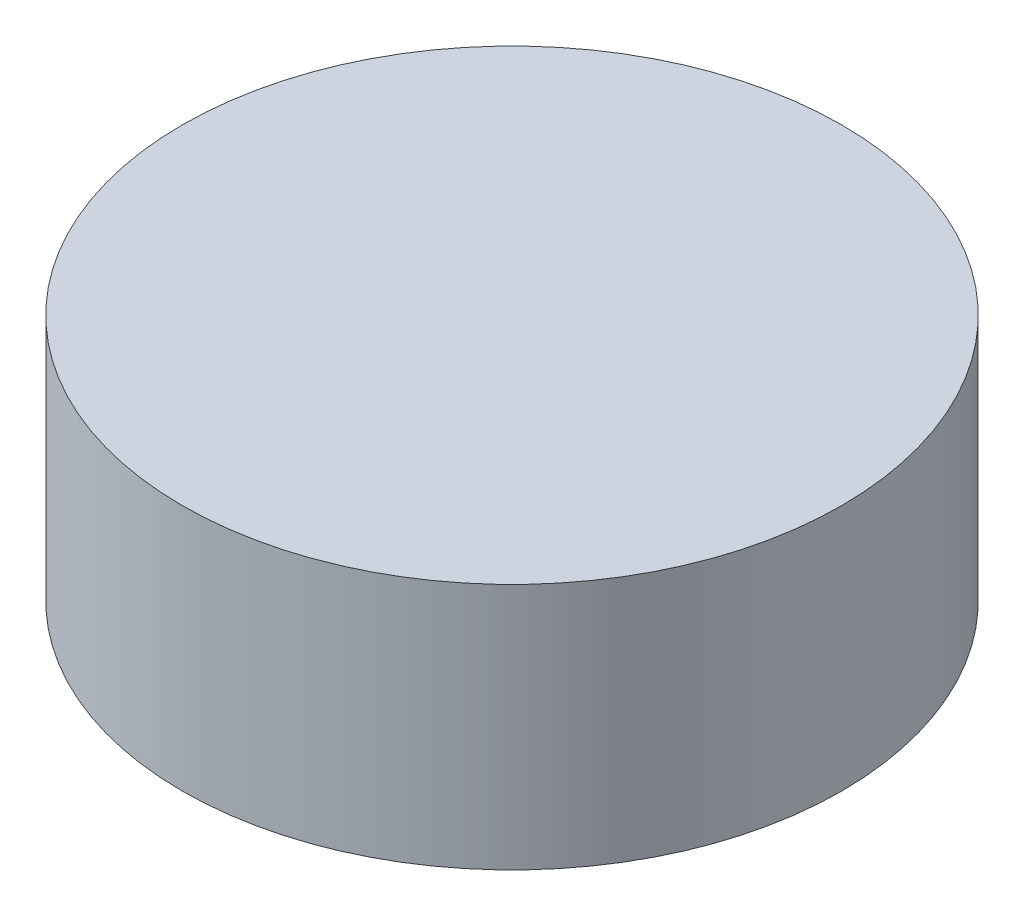
ISO-10303-21;
HEADER;
FILE_DESCRIPTION(('STEP AP214'),'2;1');
FILE_NAME('part.step','',(''),(''),'','','');
FILE_SCHEMA(('AUTOMOTIVE_DESIGN { 1 0 10303 214 1 1 1 1 }'));
ENDSEC;
DATA;
#1=APPLICATION_CONTEXT('core data for automotive mechanical design processes');
#2=APPLICATION_PROTOCOL_DEFINITION('international standard','automotive_design',2000,#1);
#3=PRODUCT_CONTEXT('',#1,'mechanical');
#4=PRODUCT('Part','Part','',(#3));
#5=PRODUCT_RELATED_PRODUCT_CATEGORY('part','',(#4));
#6=PRODUCT_DEFINITION_FORMATION('','',#4);
#7=PRODUCT_DEFINITION_CONTEXT('part definition',#1,'design');
#8=PRODUCT_DEFINITION('design','',#6,#7);
#9=PRODUCT_DEFINITION_SHAPE('','',#8);
#10=(LENGTH_UNIT() NAMED_UNIT(*) SI_UNIT(.MILLI.,.METRE.));
#11=(NAMED_UNIT(*) PLANE_ANGLE_UNIT() SI_UNIT($,.RADIAN.));
#12=(NAMED_UNIT(*) SI_UNIT($,.STERADIAN.) SOLID_ANGLE_UNIT());
#13=UNCERTAINTY_MEASURE_WITH_UNIT(LENGTH_MEASURE(1.E-05),#10,'distance_accuracy_value','');
#14=(GEOMETRIC_REPRESENTATION_CONTEXT(3) GLOBAL_UNCERTAINTY_ASSIGNED_CONTEXT((#13)) GLOBAL_UNIT_ASSIGNED_CONTEXT((#10,
#11,#12)) REPRESENTATION_CONTEXT('',''));
#15=CARTESIAN_POINT('',(0.,0.,0.));
#16=DIRECTION('',(0.,0.,1.));
#17=DIRECTION('',(1.,0.,0.));
#18=AXIS2_PLACEMENT_3D('',#15,#16,#17);
#19=CARTESIAN_POINT('',(0.,0.3,0.));
#20=DIRECTION('',(0.,-1.,0.));
#21=DIRECTION('',(0.,0.,-1.));
#22=AXIS2_PLACEMENT_3D('',#19,#20,#21);
#23=CYLINDRICAL_SURFACE('',#22,0.4);
#24=CARTESIAN_POINT('',(0.,0.3,0.));
#25=DIRECTION('',(0.,1.,0.));
#26=DIRECTION('',(0.,0.,1.));
#27=AXIS2_PLACEMENT_3D('',#24,#25,#26);
#28=CIRCLE('',#27,0.4);
#29=CARTESIAN_POINT('',(0.,0.3,0.4));
#30=VERTEX_POINT('',#29);
#31=EDGE_CURVE('E10',#30,#30,#28,.T.);
#32=ORIENTED_EDGE('',*,*,#31,.F.);
#33=EDGE_LOOP('',(#32));
#34=FACE_BOUND('',#33,.T.);
#35=CARTESIAN_POINT('',(0.,0.,0.));
#36=DIRECTION('',(0.,1.,0.));
#37=DIRECTION('',(0.,0.,1.));
#38=AXIS2_PLACEMENT_3D('',#35,#36,#37);
#39=CIRCLE('',#38,0.4);
#40=CARTESIAN_POINT('',(0.,0.,0.4));
#41=VERTEX_POINT('',#40);
#42=EDGE_CURVE('E34',#41,#41,#39,.T.);
#43=ORIENTED_EDGE('',*,*,#42,.T.);
#44=EDGE_LOOP('',(#43));
#45=FACE_BOUND('',#44,.T.);
#46=ADVANCED_FACE('F31',(#34,#45),#23,.T.);
#47=CARTESIAN_POINT('',(0.,0.3,0.));
#48=DIRECTION('',(0.,1.,0.));
#49=DIRECTION('',(0.,0.,1.));
#50=AXIS2_PLACEMENT_3D('',#47,#48,#49);
#51=PLANE('',#50);
#52=ORIENTED_EDGE('',*,*,#31,.T.);
#53=EDGE_LOOP('',(#52));
#54=FACE_BOUND('',#53,.T.);
#55=ADVANCED_FACE('F46',(#54),#51,.T.);
#56=CARTESIAN_POINT('',(0.,0.,0.));
#57=DIRECTION('',(0.,1.,0.));
#58=DIRECTION('',(0.,0.,1.));
#59=AXIS2_PLACEMENT_3D('',#56,#57,#58);
#60=PLANE('',#59);
#61=ORIENTED_EDGE('',*,*,#42,.F.);
#62=EDGE_LOOP('',(#61));
#63=FACE_BOUND('',#62,.T.);
#64=ADVANCED_FACE('F44',(#63),#60,.F.);
#65=CLOSED_SHELL('',(#46,#55,#64));
#66=MANIFOLD_SOLID_BREP('B2',#65);
#67=ADVANCED_BREP_SHAPE_REPRESENTATION('',(#18,#66),#14);
#68=SHAPE_DEFINITION_REPRESENTATION(#9,#67);
ENDSEC;
END-ISO-10303-21;
